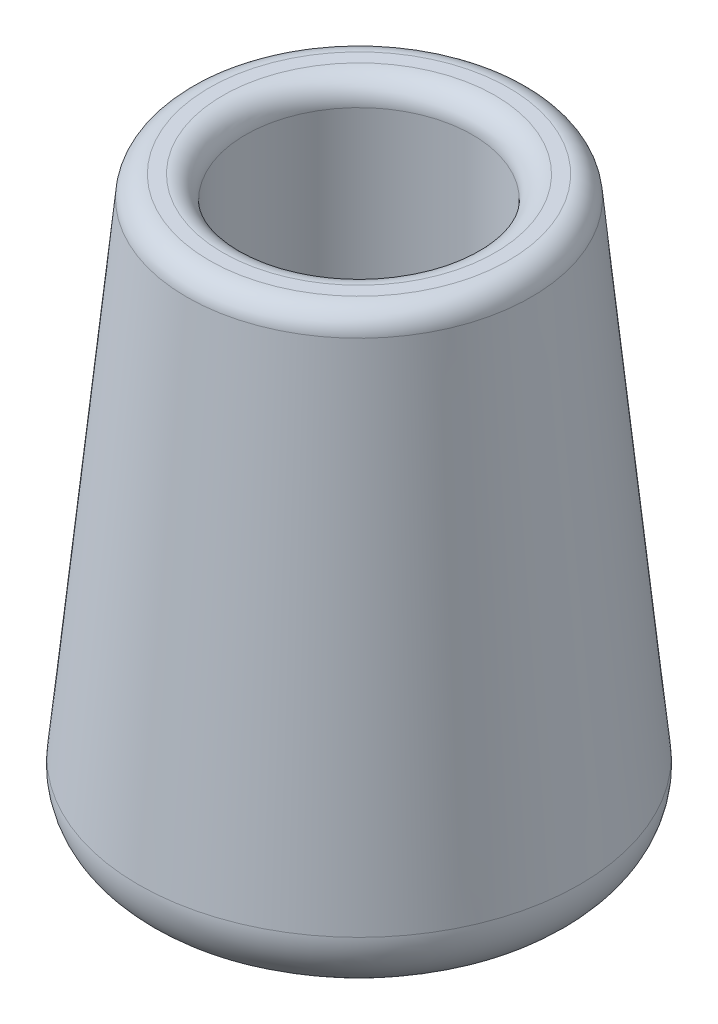
ISO-10303-21;
HEADER;
FILE_DESCRIPTION(('STEP AP214'),'2;1');
FILE_NAME('part.step','',(''),(''),'','','');
FILE_SCHEMA(('AUTOMOTIVE_DESIGN { 1 0 10303 214 1 1 1 1 }'));
ENDSEC;
DATA;
#1=APPLICATION_CONTEXT('core data for automotive mechanical design processes');
#2=APPLICATION_PROTOCOL_DEFINITION('international standard','automotive_design',2000,#1);
#3=PRODUCT_CONTEXT('',#1,'mechanical');
#4=PRODUCT('Part','Part','',(#3));
#5=PRODUCT_RELATED_PRODUCT_CATEGORY('part','',(#4));
#6=PRODUCT_DEFINITION_FORMATION('','',#4);
#7=PRODUCT_DEFINITION_CONTEXT('part definition',#1,'design');
#8=PRODUCT_DEFINITION('design','',#6,#7);
#9=PRODUCT_DEFINITION_SHAPE('','',#8);
#10=(LENGTH_UNIT() NAMED_UNIT(*) SI_UNIT(.MILLI.,.METRE.));
#11=(NAMED_UNIT(*) PLANE_ANGLE_UNIT() SI_UNIT($,.RADIAN.));
#12=(NAMED_UNIT(*) SI_UNIT($,.STERADIAN.) SOLID_ANGLE_UNIT());
#13=UNCERTAINTY_MEASURE_WITH_UNIT(LENGTH_MEASURE(1.E-05),#10,'distance_accuracy_value','');
#14=(GEOMETRIC_REPRESENTATION_CONTEXT(3) GLOBAL_UNCERTAINTY_ASSIGNED_CONTEXT((#13)) GLOBAL_UNIT_ASSIGNED_CONTEXT((#10,
#11,#12)) REPRESENTATION_CONTEXT('',''));
#15=CARTESIAN_POINT('',(0.,0.,0.));
#16=DIRECTION('',(0.,0.,1.));
#17=DIRECTION('',(1.,0.,0.));
#18=AXIS2_PLACEMENT_3D('',#15,#16,#17);
#19=CARTESIAN_POINT('',(0.,0.,0.));
#20=DIRECTION('',(0.,1.,0.));
#21=DIRECTION('',(0.,0.,1.));
#22=AXIS2_PLACEMENT_3D('',#19,#20,#21);
#23=PLANE('',#22);
#24=CARTESIAN_POINT('',(0.,0.,0.));
#25=DIRECTION('',(0.,1.,0.));
#26=DIRECTION('',(0.,0.,1.));
#27=AXIS2_PLACEMENT_3D('',#24,#25,#26);
#28=CIRCLE('',#27,14.4750621894396);
#29=CARTESIAN_POINT('',(0.,0.,14.4750621894396));
#30=VERTEX_POINT('',#29);
#31=EDGE_CURVE('E59',#30,#30,#28,.F.);
#32=ORIENTED_EDGE('',*,*,#31,.T.);
#33=EDGE_LOOP('',(#32));
#34=FACE_BOUND('',#33,.T.);
#35=ADVANCED_FACE('F39',(#34),#23,.F.);
#36=CARTESIAN_POINT('',(0.,50.,0.));
#37=DIRECTION('',(0.,1.,0.));
#38=DIRECTION('',(0.,0.,1.));
#39=AXIS2_PLACEMENT_3D('',#36,#37,#38);
#40=PLANE('',#39);
#41=CARTESIAN_POINT('',(0.,50.,0.));
#42=DIRECTION('',(0.,1.,0.));
#43=DIRECTION('',(0.,0.,1.));
#44=AXIS2_PLACEMENT_3D('',#41,#42,#43);
#45=CIRCLE('',#44,13.1900248757758);
#46=CARTESIAN_POINT('',(0.,50.,13.1900248757758));
#47=VERTEX_POINT('',#46);
#48=EDGE_CURVE('E50',#47,#47,#45,.T.);
#49=ORIENTED_EDGE('',*,*,#48,.T.);
#50=EDGE_LOOP('',(#49));
#51=FACE_BOUND('',#50,.T.);
#52=CARTESIAN_POINT('',(0.,50.,0.));
#53=DIRECTION('',(0.,1.,0.));
#54=DIRECTION('',(0.,0.,1.));
#55=AXIS2_PLACEMENT_3D('',#52,#53,#54);
#56=CIRCLE('',#55,12.);
#57=CARTESIAN_POINT('',(0.,50.,12.));
#58=VERTEX_POINT('',#57);
#59=EDGE_CURVE('E54',#58,#58,#56,.F.);
#60=ORIENTED_EDGE('',*,*,#59,.T.);
#61=EDGE_LOOP('',(#60));
#62=FACE_BOUND('',#61,.T.);
#63=ADVANCED_FACE('F82',(#51,#62),#40,.T.);
#64=CARTESIAN_POINT('',(0.,50.,0.));
#65=DIRECTION('',(0.,-1.,0.));
#66=DIRECTION('',(0.,0.,-1.));
#67=AXIS2_PLACEMENT_3D('',#64,#65,#66);
#68=CONICAL_SURFACE('',#67,15.,0.099668652491162);
#69=CARTESIAN_POINT('',(0.,48.199007438042,0.));
#70=DIRECTION('',(0.,1.,0.));
#71=DIRECTION('',(0.,0.,1.));
#72=AXIS2_PLACEMENT_3D('',#69,#70,#71);
#73=CIRCLE('',#72,15.1800992561958);
#74=CARTESIAN_POINT('',(0.,48.199007438042,15.1800992561958));
#75=VERTEX_POINT('',#74);
#76=EDGE_CURVE('E46',#75,#75,#73,.F.);
#77=ORIENTED_EDGE('',*,*,#76,.T.);
#78=EDGE_LOOP('',(#77));
#79=FACE_BOUND('',#78,.T.);
#80=CARTESIAN_POINT('',(0.,5.49751859510499,0.));
#81=DIRECTION('',(0.,-1.,0.));
#82=DIRECTION('',(0.,0.,-1.));
#83=AXIS2_PLACEMENT_3D('',#80,#81,#82);
#84=CIRCLE('',#83,19.4502481404895);
#85=CARTESIAN_POINT('',(0.,5.49751859510499,-19.4502481404895));
#86=VERTEX_POINT('',#85);
#87=EDGE_CURVE('E62',#86,#86,#84,.F.);
#88=ORIENTED_EDGE('',*,*,#87,.T.);
#89=EDGE_LOOP('',(#88));
#90=FACE_BOUND('',#89,.T.);
#91=ADVANCED_FACE('F73',(#79,#90),#68,.T.);
#92=CARTESIAN_POINT('',(0.,50.0001,0.));
#93=DIRECTION('',(0.,-1.,0.));
#94=DIRECTION('',(0.,0.,-1.));
#95=AXIS2_PLACEMENT_3D('',#92,#93,#94);
#96=CYLINDRICAL_SURFACE('',#95,10.);
#97=CARTESIAN_POINT('',(0.,48.,0.));
#98=DIRECTION('',(0.,1.,0.));
#99=DIRECTION('',(0.,0.,1.));
#100=AXIS2_PLACEMENT_3D('',#97,#98,#99);
#101=CIRCLE('',#100,10.);
#102=CARTESIAN_POINT('',(0.,48.,10.));
#103=VERTEX_POINT('',#102);
#104=EDGE_CURVE('E11',#103,#103,#101,.T.);
#105=ORIENTED_EDGE('',*,*,#104,.T.);
#106=EDGE_LOOP('',(#105));
#107=FACE_BOUND('',#106,.T.);
#108=CARTESIAN_POINT('',(0.,30.,0.));
#109=DIRECTION('',(0.,1.,0.));
#110=DIRECTION('',(0.,0.,1.));
#111=AXIS2_PLACEMENT_3D('',#108,#109,#110);
#112=CIRCLE('',#111,10.);
#113=CARTESIAN_POINT('',(0.,30.,10.));
#114=VERTEX_POINT('',#113);
#115=EDGE_CURVE('E65',#114,#114,#112,.T.);
#116=ORIENTED_EDGE('',*,*,#115,.F.);
#117=EDGE_LOOP('',(#116));
#118=FACE_BOUND('',#117,.T.);
#119=ADVANCED_FACE('F71',(#107,#118),#96,.F.);
#120=CARTESIAN_POINT('',(0.,30.,0.));
#121=DIRECTION('',(0.,1.,0.));
#122=DIRECTION('',(0.,0.,1.));
#123=AXIS2_PLACEMENT_3D('',#120,#121,#122);
#124=PLANE('',#123);
#125=ORIENTED_EDGE('',*,*,#115,.T.);
#126=EDGE_LOOP('',(#125));
#127=FACE_BOUND('',#126,.T.);
#128=ADVANCED_FACE('F69',(#127),#124,.T.);
#129=CARTESIAN_POINT('',(0.,5.,0.));
#130=DIRECTION('',(0.,1.,0.));
#131=DIRECTION('',(0.,0.,1.));
#132=AXIS2_PLACEMENT_3D('',#129,#130,#131);
#133=TOROIDAL_SURFACE('',#132,14.4750621894396,5.);
#134=ORIENTED_EDGE('',*,*,#31,.F.);
#135=EDGE_LOOP('',(#134));
#136=FACE_BOUND('',#135,.T.);
#137=ORIENTED_EDGE('',*,*,#87,.F.);
#138=EDGE_LOOP('',(#137));
#139=FACE_BOUND('',#138,.T.);
#140=ADVANCED_FACE('F80',(#136,#139),#133,.T.);
#141=CARTESIAN_POINT('',(0.,48.,0.));
#142=DIRECTION('',(0.,1.,0.));
#143=DIRECTION('',(0.,0.,1.));
#144=AXIS2_PLACEMENT_3D('',#141,#142,#143);
#145=TOROIDAL_SURFACE('',#144,13.1900248757758,2.);
#146=ORIENTED_EDGE('',*,*,#76,.F.);
#147=EDGE_LOOP('',(#146));
#148=FACE_BOUND('',#147,.T.);
#149=ORIENTED_EDGE('',*,*,#48,.F.);
#150=EDGE_LOOP('',(#149));
#151=FACE_BOUND('',#150,.T.);
#152=ADVANCED_FACE('F94',(#148,#151),#145,.T.);
#153=CARTESIAN_POINT('',(0.,48.,0.));
#154=DIRECTION('',(0.,1.,0.));
#155=DIRECTION('',(0.,0.,1.));
#156=AXIS2_PLACEMENT_3D('',#153,#154,#155);
#157=TOROIDAL_SURFACE('',#156,12.,2.);
#158=ORIENTED_EDGE('',*,*,#104,.F.);
#159=EDGE_LOOP('',(#158));
#160=FACE_BOUND('',#159,.T.);
#161=ORIENTED_EDGE('',*,*,#59,.F.);
#162=EDGE_LOOP('',(#161));
#163=FACE_BOUND('',#162,.T.);
#164=ADVANCED_FACE('F41',(#160,#163),#157,.T.);
#165=CLOSED_SHELL('',(#35,#63,#91,#119,#128,#140,#152,#164));
#166=MANIFOLD_SOLID_BREP('B2',#165);
#167=ADVANCED_BREP_SHAPE_REPRESENTATION('',(#18,#166),#14);
#168=SHAPE_DEFINITION_REPRESENTATION(#9,#167);
ENDSEC;
END-ISO-10303-21;
